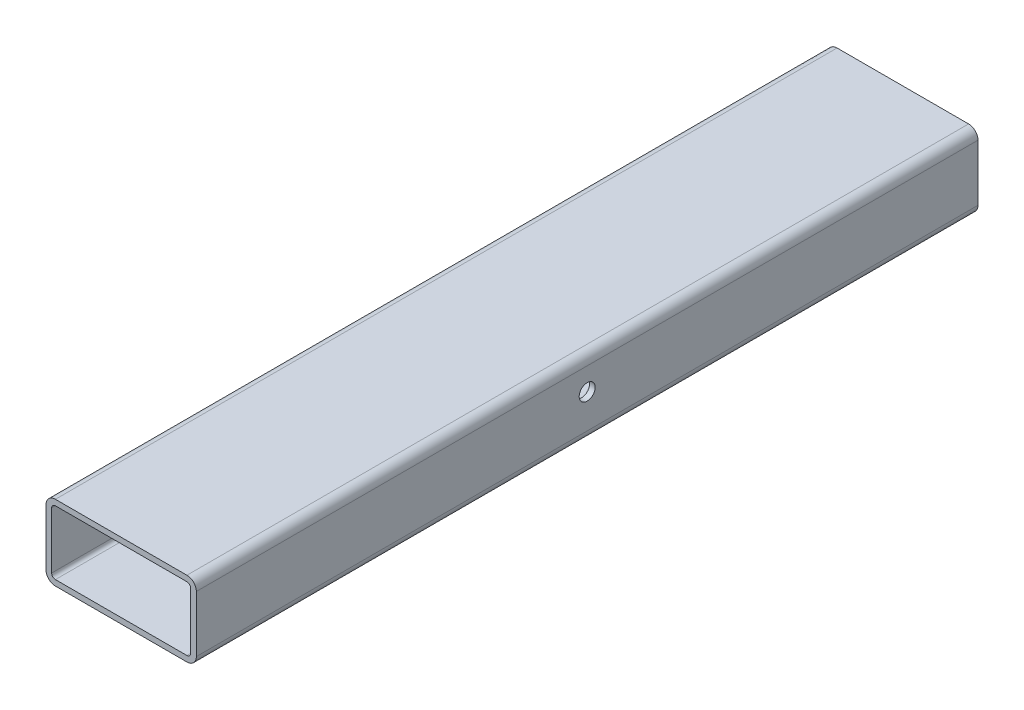
ISO-10303-21;
HEADER;
FILE_DESCRIPTION(('STEP AP214'),'2;1');
FILE_NAME('part.step','',(''),(''),'','','');
FILE_SCHEMA(('AUTOMOTIVE_DESIGN { 1 0 10303 214 1 1 1 1 }'));
ENDSEC;
DATA;
#1=APPLICATION_CONTEXT('core data for automotive mechanical design processes');
#2=APPLICATION_PROTOCOL_DEFINITION('international standard','automotive_design',2000,#1);
#3=PRODUCT_CONTEXT('',#1,'mechanical');
#4=PRODUCT('Part','Part','',(#3));
#5=PRODUCT_RELATED_PRODUCT_CATEGORY('part','',(#4));
#6=PRODUCT_DEFINITION_FORMATION('','',#4);
#7=PRODUCT_DEFINITION_CONTEXT('part definition',#1,'design');
#8=PRODUCT_DEFINITION('design','',#6,#7);
#9=PRODUCT_DEFINITION_SHAPE('','',#8);
#10=(LENGTH_UNIT() NAMED_UNIT(*) SI_UNIT(.MILLI.,.METRE.));
#11=(NAMED_UNIT(*) PLANE_ANGLE_UNIT() SI_UNIT($,.RADIAN.));
#12=(NAMED_UNIT(*) SI_UNIT($,.STERADIAN.) SOLID_ANGLE_UNIT());
#13=UNCERTAINTY_MEASURE_WITH_UNIT(LENGTH_MEASURE(1.E-05),#10,'distance_accuracy_value','');
#14=(GEOMETRIC_REPRESENTATION_CONTEXT(3) GLOBAL_UNCERTAINTY_ASSIGNED_CONTEXT((#13)) GLOBAL_UNIT_ASSIGNED_CONTEXT((#10,
#11,#12)) REPRESENTATION_CONTEXT('',''));
#15=CARTESIAN_POINT('',(0.,0.,0.));
#16=DIRECTION('',(0.,0.,1.));
#17=DIRECTION('',(1.,0.,0.));
#18=AXIS2_PLACEMENT_3D('',#15,#16,#17);
#19=CARTESIAN_POINT('',(35.,-15.,208.));
#20=DIRECTION('',(0.,0.,1.));
#21=DIRECTION('',(1.,0.,0.));
#22=AXIS2_PLACEMENT_3D('',#19,#20,#21);
#23=PLANE('',#22);
#24=CARTESIAN_POINT('',(35.,-15.,208.));
#25=DIRECTION('',(0.,0.,1.));
#26=DIRECTION('',(1.,0.,0.));
#27=AXIS2_PLACEMENT_3D('',#24,#25,#26);
#28=CIRCLE('',#27,5.);
#29=CARTESIAN_POINT('',(35.,-20.,208.));
#30=VERTEX_POINT('',#29);
#31=CARTESIAN_POINT('',(40.,-15.,208.));
#32=VERTEX_POINT('',#31);
#33=EDGE_CURVE('E225',#30,#32,#28,.T.);
#34=ORIENTED_EDGE('',*,*,#33,.T.);
#35=DIRECTION('',(0.,1.,0.));
#36=VECTOR('',#35,1.);
#37=CARTESIAN_POINT('',(40.,-15.,208.));
#38=LINE('',#37,#36);
#39=CARTESIAN_POINT('',(40.,15.,208.));
#40=VERTEX_POINT('',#39);
#41=EDGE_CURVE('E228',#32,#40,#38,.T.);
#42=ORIENTED_EDGE('',*,*,#41,.T.);
#43=CARTESIAN_POINT('',(35.,15.,208.));
#44=DIRECTION('',(0.,0.,1.));
#45=DIRECTION('',(-1.,0.,0.));
#46=AXIS2_PLACEMENT_3D('',#43,#44,#45);
#47=CIRCLE('',#46,5.);
#48=CARTESIAN_POINT('',(35.,20.,208.));
#49=VERTEX_POINT('',#48);
#50=EDGE_CURVE('E231',#40,#49,#47,.T.);
#51=ORIENTED_EDGE('',*,*,#50,.T.);
#52=DIRECTION('',(-1.,0.,0.));
#53=VECTOR('',#52,1.);
#54=CARTESIAN_POINT('',(-35.,20.,208.));
#55=LINE('',#54,#53);
#56=CARTESIAN_POINT('',(-35.,20.,208.));
#57=VERTEX_POINT('',#56);
#58=EDGE_CURVE('E233',#49,#57,#55,.T.);
#59=ORIENTED_EDGE('',*,*,#58,.T.);
#60=CARTESIAN_POINT('',(-35.,15.,208.));
#61=DIRECTION('',(0.,0.,1.));
#62=DIRECTION('',(-1.,0.,0.));
#63=AXIS2_PLACEMENT_3D('',#60,#61,#62);
#64=CIRCLE('',#63,5.);
#65=CARTESIAN_POINT('',(-40.,15.,208.));
#66=VERTEX_POINT('',#65);
#67=EDGE_CURVE('E235',#57,#66,#64,.T.);
#68=ORIENTED_EDGE('',*,*,#67,.T.);
#69=DIRECTION('',(0.,-1.,0.));
#70=VECTOR('',#69,1.);
#71=CARTESIAN_POINT('',(-40.,-15.,208.));
#72=LINE('',#71,#70);
#73=CARTESIAN_POINT('',(-40.,-15.,208.));
#74=VERTEX_POINT('',#73);
#75=EDGE_CURVE('E237',#66,#74,#72,.T.);
#76=ORIENTED_EDGE('',*,*,#75,.T.);
#77=CARTESIAN_POINT('',(-35.,-15.,208.));
#78=DIRECTION('',(0.,0.,1.));
#79=DIRECTION('',(-1.,0.,0.));
#80=AXIS2_PLACEMENT_3D('',#77,#78,#79);
#81=CIRCLE('',#80,5.);
#82=CARTESIAN_POINT('',(-35.,-20.,208.));
#83=VERTEX_POINT('',#82);
#84=EDGE_CURVE('E239',#74,#83,#81,.T.);
#85=ORIENTED_EDGE('',*,*,#84,.T.);
#86=DIRECTION('',(1.,0.,0.));
#87=VECTOR('',#86,1.);
#88=CARTESIAN_POINT('',(-35.,-20.,208.));
#89=LINE('',#88,#87);
#90=EDGE_CURVE('E241',#83,#30,#89,.T.);
#91=ORIENTED_EDGE('',*,*,#90,.T.);
#92=EDGE_LOOP('',(#34,#42,#51,#59,#68,#76,#85,#91));
#93=FACE_BOUND('',#92,.T.);
#94=DIRECTION('',(1.,0.,0.));
#95=VECTOR('',#94,1.);
#96=CARTESIAN_POINT('',(-35.,-17.,208.));
#97=LINE('',#96,#95);
#98=CARTESIAN_POINT('',(-35.,-17.,208.));
#99=VERTEX_POINT('',#98);
#100=CARTESIAN_POINT('',(35.,-17.,208.));
#101=VERTEX_POINT('',#100);
#102=EDGE_CURVE('E166',#99,#101,#97,.T.);
#103=ORIENTED_EDGE('',*,*,#102,.F.);
#104=CARTESIAN_POINT('',(-35.,-15.,208.));
#105=DIRECTION('',(0.,0.,1.));
#106=DIRECTION('',(-1.,0.,0.));
#107=AXIS2_PLACEMENT_3D('',#104,#105,#106);
#108=CIRCLE('',#107,2.);
#109=CARTESIAN_POINT('',(-37.,-15.,208.));
#110=VERTEX_POINT('',#109);
#111=EDGE_CURVE('E158',#110,#99,#108,.T.);
#112=ORIENTED_EDGE('',*,*,#111,.F.);
#113=DIRECTION('',(0.,-1.,0.));
#114=VECTOR('',#113,1.);
#115=CARTESIAN_POINT('',(-37.,-15.,208.));
#116=LINE('',#115,#114);
#117=CARTESIAN_POINT('',(-37.,15.,208.));
#118=VERTEX_POINT('',#117);
#119=EDGE_CURVE('E192',#118,#110,#116,.T.);
#120=ORIENTED_EDGE('',*,*,#119,.F.);
#121=CARTESIAN_POINT('',(-35.,15.,208.));
#122=DIRECTION('',(0.,0.,1.));
#123=DIRECTION('',(-1.,0.,0.));
#124=AXIS2_PLACEMENT_3D('',#121,#122,#123);
#125=CIRCLE('',#124,2.);
#126=CARTESIAN_POINT('',(-35.,17.,208.));
#127=VERTEX_POINT('',#126);
#128=EDGE_CURVE('E190',#127,#118,#125,.T.);
#129=ORIENTED_EDGE('',*,*,#128,.F.);
#130=DIRECTION('',(-1.,0.,0.));
#131=VECTOR('',#130,1.);
#132=CARTESIAN_POINT('',(-35.,17.,208.));
#133=LINE('',#132,#131);
#134=CARTESIAN_POINT('',(35.,17.,208.));
#135=VERTEX_POINT('',#134);
#136=EDGE_CURVE('E188',#135,#127,#133,.T.);
#137=ORIENTED_EDGE('',*,*,#136,.F.);
#138=CARTESIAN_POINT('',(35.,15.,208.));
#139=DIRECTION('',(0.,0.,1.));
#140=DIRECTION('',(-1.,0.,0.));
#141=AXIS2_PLACEMENT_3D('',#138,#139,#140);
#142=CIRCLE('',#141,2.);
#143=CARTESIAN_POINT('',(37.,15.,208.));
#144=VERTEX_POINT('',#143);
#145=EDGE_CURVE('E186',#144,#135,#142,.T.);
#146=ORIENTED_EDGE('',*,*,#145,.F.);
#147=DIRECTION('',(0.,1.,0.));
#148=VECTOR('',#147,1.);
#149=CARTESIAN_POINT('',(37.,-15.,208.));
#150=LINE('',#149,#148);
#151=CARTESIAN_POINT('',(37.,-15.,208.));
#152=VERTEX_POINT('',#151);
#153=EDGE_CURVE('E181',#152,#144,#150,.T.);
#154=ORIENTED_EDGE('',*,*,#153,.F.);
#155=CARTESIAN_POINT('',(35.,-15.,208.));
#156=DIRECTION('',(0.,0.,1.));
#157=DIRECTION('',(1.,0.,0.));
#158=AXIS2_PLACEMENT_3D('',#155,#156,#157);
#159=CIRCLE('',#158,2.);
#160=EDGE_CURVE('E179',#101,#152,#159,.T.);
#161=ORIENTED_EDGE('',*,*,#160,.F.);
#162=EDGE_LOOP('',(#103,#112,#120,#129,#137,#146,#154,#161));
#163=FACE_BOUND('',#162,.T.);
#164=ADVANCED_FACE('F45',(#93,#163),#23,.T.);
#165=CARTESIAN_POINT('',(35.,-15.,-208.));
#166=DIRECTION('',(0.,0.,1.));
#167=DIRECTION('',(1.,0.,0.));
#168=AXIS2_PLACEMENT_3D('',#165,#166,#167);
#169=PLANE('',#168);
#170=CARTESIAN_POINT('',(35.,-15.,-208.));
#171=DIRECTION('',(0.,0.,1.));
#172=DIRECTION('',(1.,0.,0.));
#173=AXIS2_PLACEMENT_3D('',#170,#171,#172);
#174=CIRCLE('',#173,5.);
#175=CARTESIAN_POINT('',(35.,-20.,-208.));
#176=VERTEX_POINT('',#175);
#177=CARTESIAN_POINT('',(40.,-15.,-208.));
#178=VERTEX_POINT('',#177);
#179=EDGE_CURVE('E174',#176,#178,#174,.T.);
#180=ORIENTED_EDGE('',*,*,#179,.F.);
#181=DIRECTION('',(1.,0.,0.));
#182=VECTOR('',#181,1.);
#183=CARTESIAN_POINT('',(-35.,-20.,-208.));
#184=LINE('',#183,#182);
#185=CARTESIAN_POINT('',(-35.,-20.,-208.));
#186=VERTEX_POINT('',#185);
#187=EDGE_CURVE('E229',#186,#176,#184,.T.);
#188=ORIENTED_EDGE('',*,*,#187,.F.);
#189=CARTESIAN_POINT('',(-35.,-15.,-208.));
#190=DIRECTION('',(0.,0.,1.));
#191=DIRECTION('',(-1.,0.,0.));
#192=AXIS2_PLACEMENT_3D('',#189,#190,#191);
#193=CIRCLE('',#192,5.);
#194=CARTESIAN_POINT('',(-40.,-15.,-208.));
#195=VERTEX_POINT('',#194);
#196=EDGE_CURVE('E256',#195,#186,#193,.T.);
#197=ORIENTED_EDGE('',*,*,#196,.F.);
#198=DIRECTION('',(0.,-1.,0.));
#199=VECTOR('',#198,1.);
#200=CARTESIAN_POINT('',(-40.,-15.,-208.));
#201=LINE('',#200,#199);
#202=CARTESIAN_POINT('',(-40.,15.,-208.));
#203=VERTEX_POINT('',#202);
#204=EDGE_CURVE('E254',#203,#195,#201,.T.);
#205=ORIENTED_EDGE('',*,*,#204,.F.);
#206=CARTESIAN_POINT('',(-35.,15.,-208.));
#207=DIRECTION('',(0.,0.,1.));
#208=DIRECTION('',(-1.,0.,0.));
#209=AXIS2_PLACEMENT_3D('',#206,#207,#208);
#210=CIRCLE('',#209,5.);
#211=CARTESIAN_POINT('',(-35.,20.,-208.));
#212=VERTEX_POINT('',#211);
#213=EDGE_CURVE('E252',#212,#203,#210,.T.);
#214=ORIENTED_EDGE('',*,*,#213,.F.);
#215=DIRECTION('',(-1.,0.,0.));
#216=VECTOR('',#215,1.);
#217=CARTESIAN_POINT('',(-35.,20.,-208.));
#218=LINE('',#217,#216);
#219=CARTESIAN_POINT('',(35.,20.,-208.));
#220=VERTEX_POINT('',#219);
#221=EDGE_CURVE('E250',#220,#212,#218,.T.);
#222=ORIENTED_EDGE('',*,*,#221,.F.);
#223=CARTESIAN_POINT('',(35.,15.,-208.));
#224=DIRECTION('',(0.,0.,1.));
#225=DIRECTION('',(-1.,0.,0.));
#226=AXIS2_PLACEMENT_3D('',#223,#224,#225);
#227=CIRCLE('',#226,5.);
#228=CARTESIAN_POINT('',(40.,15.,-208.));
#229=VERTEX_POINT('',#228);
#230=EDGE_CURVE('E248',#229,#220,#227,.T.);
#231=ORIENTED_EDGE('',*,*,#230,.F.);
#232=DIRECTION('',(0.,1.,0.));
#233=VECTOR('',#232,1.);
#234=CARTESIAN_POINT('',(40.,-15.,-208.));
#235=LINE('',#234,#233);
#236=EDGE_CURVE('E246',#178,#229,#235,.T.);
#237=ORIENTED_EDGE('',*,*,#236,.F.);
#238=EDGE_LOOP('',(#180,#188,#197,#205,#214,#222,#231,#237));
#239=FACE_BOUND('',#238,.T.);
#240=CARTESIAN_POINT('',(-35.,-15.,-208.));
#241=DIRECTION('',(0.,0.,1.));
#242=DIRECTION('',(-1.,0.,0.));
#243=AXIS2_PLACEMENT_3D('',#240,#241,#242);
#244=CIRCLE('',#243,2.);
#245=CARTESIAN_POINT('',(-37.,-15.,-208.));
#246=VERTEX_POINT('',#245);
#247=CARTESIAN_POINT('',(-35.,-17.,-208.));
#248=VERTEX_POINT('',#247);
#249=EDGE_CURVE('E68',#246,#248,#244,.T.);
#250=ORIENTED_EDGE('',*,*,#249,.T.);
#251=DIRECTION('',(1.,0.,0.));
#252=VECTOR('',#251,1.);
#253=CARTESIAN_POINT('',(-35.,-17.,-208.));
#254=LINE('',#253,#252);
#255=CARTESIAN_POINT('',(35.,-17.,-208.));
#256=VERTEX_POINT('',#255);
#257=EDGE_CURVE('E173',#248,#256,#254,.T.);
#258=ORIENTED_EDGE('',*,*,#257,.T.);
#259=CARTESIAN_POINT('',(35.,-15.,-208.));
#260=DIRECTION('',(0.,0.,1.));
#261=DIRECTION('',(1.,0.,0.));
#262=AXIS2_PLACEMENT_3D('',#259,#260,#261);
#263=CIRCLE('',#262,2.);
#264=CARTESIAN_POINT('',(37.,-15.,-208.));
#265=VERTEX_POINT('',#264);
#266=EDGE_CURVE('E197',#256,#265,#263,.T.);
#267=ORIENTED_EDGE('',*,*,#266,.T.);
#268=DIRECTION('',(0.,1.,0.));
#269=VECTOR('',#268,1.);
#270=CARTESIAN_POINT('',(37.,-15.,-208.));
#271=LINE('',#270,#269);
#272=CARTESIAN_POINT('',(37.,15.,-208.));
#273=VERTEX_POINT('',#272);
#274=EDGE_CURVE('E200',#265,#273,#271,.T.);
#275=ORIENTED_EDGE('',*,*,#274,.T.);
#276=CARTESIAN_POINT('',(35.,15.,-208.));
#277=DIRECTION('',(0.,0.,1.));
#278=DIRECTION('',(-1.,0.,0.));
#279=AXIS2_PLACEMENT_3D('',#276,#277,#278);
#280=CIRCLE('',#279,2.);
#281=CARTESIAN_POINT('',(35.,17.,-208.));
#282=VERTEX_POINT('',#281);
#283=EDGE_CURVE('E203',#273,#282,#280,.T.);
#284=ORIENTED_EDGE('',*,*,#283,.T.);
#285=DIRECTION('',(-1.,0.,0.));
#286=VECTOR('',#285,1.);
#287=CARTESIAN_POINT('',(-35.,17.,-208.));
#288=LINE('',#287,#286);
#289=CARTESIAN_POINT('',(-35.,17.,-208.));
#290=VERTEX_POINT('',#289);
#291=EDGE_CURVE('E206',#282,#290,#288,.T.);
#292=ORIENTED_EDGE('',*,*,#291,.T.);
#293=CARTESIAN_POINT('',(-35.,15.,-208.));
#294=DIRECTION('',(0.,0.,1.));
#295=DIRECTION('',(-1.,0.,0.));
#296=AXIS2_PLACEMENT_3D('',#293,#294,#295);
#297=CIRCLE('',#296,2.);
#298=CARTESIAN_POINT('',(-37.,15.,-208.));
#299=VERTEX_POINT('',#298);
#300=EDGE_CURVE('E209',#290,#299,#297,.T.);
#301=ORIENTED_EDGE('',*,*,#300,.T.);
#302=DIRECTION('',(0.,-1.,0.));
#303=VECTOR('',#302,1.);
#304=CARTESIAN_POINT('',(-37.,-15.,-208.));
#305=LINE('',#304,#303);
#306=EDGE_CURVE('E167',#299,#246,#305,.T.);
#307=ORIENTED_EDGE('',*,*,#306,.T.);
#308=EDGE_LOOP('',(#250,#258,#267,#275,#284,#292,#301,#307));
#309=FACE_BOUND('',#308,.T.);
#310=ADVANCED_FACE('F286',(#239,#309),#169,.F.);
#311=CARTESIAN_POINT('',(35.,-15.,208.));
#312=DIRECTION('',(0.,0.,-1.));
#313=DIRECTION('',(-1.,0.,0.));
#314=AXIS2_PLACEMENT_3D('',#311,#312,#313);
#315=CYLINDRICAL_SURFACE('',#314,5.);
#316=ORIENTED_EDGE('',*,*,#179,.T.);
#317=DIRECTION('',(0.,0.,-1.));
#318=VECTOR('',#317,1.);
#319=CARTESIAN_POINT('',(40.,-15.,208.));
#320=LINE('',#319,#318);
#321=EDGE_CURVE('E11',#32,#178,#320,.T.);
#322=ORIENTED_EDGE('',*,*,#321,.F.);
#323=ORIENTED_EDGE('',*,*,#33,.F.);
#324=DIRECTION('',(0.,0.,-1.));
#325=VECTOR('',#324,1.);
#326=CARTESIAN_POINT('',(35.,-20.,208.));
#327=LINE('',#326,#325);
#328=EDGE_CURVE('E243',#30,#176,#327,.T.);
#329=ORIENTED_EDGE('',*,*,#328,.T.);
#330=EDGE_LOOP('',(#316,#322,#323,#329));
#331=FACE_BOUND('',#330,.T.);
#332=ADVANCED_FACE('F47',(#331),#315,.T.);
#333=CARTESIAN_POINT('',(40.,-15.,208.));
#334=DIRECTION('',(-1.,0.,0.));
#335=DIRECTION('',(0.,-1.,0.));
#336=AXIS2_PLACEMENT_3D('',#333,#334,#335);
#337=PLANE('',#336);
#338=CARTESIAN_POINT('',(40.,3.00000000000013,0.));
#339=DIRECTION('',(1.,0.,0.));
#340=DIRECTION('',(0.,0.,-1.));
#341=AXIS2_PLACEMENT_3D('',#338,#339,#340);
#342=CIRCLE('',#341,4.24999999999999);
#343=CARTESIAN_POINT('',(40.,3.00000000000013,-4.24999999999999));
#344=VERTEX_POINT('',#343);
#345=EDGE_CURVE('E378',#344,#344,#342,.T.);
#346=ORIENTED_EDGE('',*,*,#345,.F.);
#347=EDGE_LOOP('',(#346));
#348=FACE_BOUND('',#347,.T.);
#349=ORIENTED_EDGE('',*,*,#236,.T.);
#350=DIRECTION('',(0.,0.,-1.));
#351=VECTOR('',#350,1.);
#352=CARTESIAN_POINT('',(40.,15.,208.));
#353=LINE('',#352,#351);
#354=EDGE_CURVE('E53',#40,#229,#353,.T.);
#355=ORIENTED_EDGE('',*,*,#354,.F.);
#356=ORIENTED_EDGE('',*,*,#41,.F.);
#357=ORIENTED_EDGE('',*,*,#321,.T.);
#358=EDGE_LOOP('',(#349,#355,#356,#357));
#359=FACE_BOUND('',#358,.T.);
#360=ADVANCED_FACE('F303',(#348,#359),#337,.F.);
#361=CARTESIAN_POINT('',(35.,15.,208.));
#362=DIRECTION('',(0.,0.,-1.));
#363=DIRECTION('',(-1.,0.,0.));
#364=AXIS2_PLACEMENT_3D('',#361,#362,#363);
#365=CYLINDRICAL_SURFACE('',#364,5.);
#366=ORIENTED_EDGE('',*,*,#230,.T.);
#367=DIRECTION('',(0.,0.,-1.));
#368=VECTOR('',#367,1.);
#369=CARTESIAN_POINT('',(35.,20.,208.));
#370=LINE('',#369,#368);
#371=EDGE_CURVE('E273',#49,#220,#370,.T.);
#372=ORIENTED_EDGE('',*,*,#371,.F.);
#373=ORIENTED_EDGE('',*,*,#50,.F.);
#374=ORIENTED_EDGE('',*,*,#354,.T.);
#375=EDGE_LOOP('',(#366,#372,#373,#374));
#376=FACE_BOUND('',#375,.T.);
#377=ADVANCED_FACE('F280',(#376),#365,.T.);
#378=CARTESIAN_POINT('',(-35.,20.,208.));
#379=DIRECTION('',(0.,-1.,0.));
#380=DIRECTION('',(0.,0.,-1.));
#381=AXIS2_PLACEMENT_3D('',#378,#379,#380);
#382=PLANE('',#381);
#383=ORIENTED_EDGE('',*,*,#221,.T.);
#384=DIRECTION('',(0.,0.,-1.));
#385=VECTOR('',#384,1.);
#386=CARTESIAN_POINT('',(-35.,20.,208.));
#387=LINE('',#386,#385);
#388=EDGE_CURVE('E270',#57,#212,#387,.T.);
#389=ORIENTED_EDGE('',*,*,#388,.F.);
#390=ORIENTED_EDGE('',*,*,#58,.F.);
#391=ORIENTED_EDGE('',*,*,#371,.T.);
#392=EDGE_LOOP('',(#383,#389,#390,#391));
#393=FACE_BOUND('',#392,.T.);
#394=ADVANCED_FACE('F292',(#393),#382,.F.);
#395=CARTESIAN_POINT('',(-35.,15.,208.));
#396=DIRECTION('',(0.,0.,-1.));
#397=DIRECTION('',(-1.,0.,0.));
#398=AXIS2_PLACEMENT_3D('',#395,#396,#397);
#399=CYLINDRICAL_SURFACE('',#398,5.);
#400=ORIENTED_EDGE('',*,*,#213,.T.);
#401=DIRECTION('',(0.,0.,-1.));
#402=VECTOR('',#401,1.);
#403=CARTESIAN_POINT('',(-40.,15.,208.));
#404=LINE('',#403,#402);
#405=EDGE_CURVE('E267',#66,#203,#404,.T.);
#406=ORIENTED_EDGE('',*,*,#405,.F.);
#407=ORIENTED_EDGE('',*,*,#67,.F.);
#408=ORIENTED_EDGE('',*,*,#388,.T.);
#409=EDGE_LOOP('',(#400,#406,#407,#408));
#410=FACE_BOUND('',#409,.T.);
#411=ADVANCED_FACE('F296',(#410),#399,.T.);
#412=CARTESIAN_POINT('',(-40.,-15.,208.));
#413=DIRECTION('',(1.,0.,0.));
#414=DIRECTION('',(0.,1.,0.));
#415=AXIS2_PLACEMENT_3D('',#412,#413,#414);
#416=PLANE('',#415);
#417=ORIENTED_EDGE('',*,*,#204,.T.);
#418=DIRECTION('',(0.,0.,-1.));
#419=VECTOR('',#418,1.);
#420=CARTESIAN_POINT('',(-40.,-15.,208.));
#421=LINE('',#420,#419);
#422=EDGE_CURVE('E264',#74,#195,#421,.T.);
#423=ORIENTED_EDGE('',*,*,#422,.F.);
#424=ORIENTED_EDGE('',*,*,#75,.F.);
#425=ORIENTED_EDGE('',*,*,#405,.T.);
#426=EDGE_LOOP('',(#417,#423,#424,#425));
#427=FACE_BOUND('',#426,.T.);
#428=ADVANCED_FACE('F316',(#427),#416,.F.);
#429=CARTESIAN_POINT('',(-35.,-15.,208.));
#430=DIRECTION('',(0.,0.,-1.));
#431=DIRECTION('',(-1.,0.,0.));
#432=AXIS2_PLACEMENT_3D('',#429,#430,#431);
#433=CYLINDRICAL_SURFACE('',#432,5.);
#434=ORIENTED_EDGE('',*,*,#196,.T.);
#435=DIRECTION('',(0.,0.,-1.));
#436=VECTOR('',#435,1.);
#437=CARTESIAN_POINT('',(-35.,-20.,208.));
#438=LINE('',#437,#436);
#439=EDGE_CURVE('E261',#83,#186,#438,.T.);
#440=ORIENTED_EDGE('',*,*,#439,.F.);
#441=ORIENTED_EDGE('',*,*,#84,.F.);
#442=ORIENTED_EDGE('',*,*,#422,.T.);
#443=EDGE_LOOP('',(#434,#440,#441,#442));
#444=FACE_BOUND('',#443,.T.);
#445=ADVANCED_FACE('F314',(#444),#433,.T.);
#446=CARTESIAN_POINT('',(-35.,-20.,208.));
#447=DIRECTION('',(0.,1.,0.));
#448=DIRECTION('',(0.,0.,1.));
#449=AXIS2_PLACEMENT_3D('',#446,#447,#448);
#450=PLANE('',#449);
#451=ORIENTED_EDGE('',*,*,#187,.T.);
#452=ORIENTED_EDGE('',*,*,#328,.F.);
#453=ORIENTED_EDGE('',*,*,#90,.F.);
#454=ORIENTED_EDGE('',*,*,#439,.T.);
#455=EDGE_LOOP('',(#451,#452,#453,#454));
#456=FACE_BOUND('',#455,.T.);
#457=ADVANCED_FACE('F309',(#456),#450,.F.);
#458=CARTESIAN_POINT('',(-35.,-15.,208.));
#459=DIRECTION('',(0.,0.,-1.));
#460=DIRECTION('',(-1.,0.,0.));
#461=AXIS2_PLACEMENT_3D('',#458,#459,#460);
#462=CYLINDRICAL_SURFACE('',#461,2.);
#463=ORIENTED_EDGE('',*,*,#249,.F.);
#464=DIRECTION('',(0.,0.,-1.));
#465=VECTOR('',#464,1.);
#466=CARTESIAN_POINT('',(-37.,-15.,208.));
#467=LINE('',#466,#465);
#468=EDGE_CURVE('E162',#110,#246,#467,.T.);
#469=ORIENTED_EDGE('',*,*,#468,.F.);
#470=ORIENTED_EDGE('',*,*,#111,.T.);
#471=DIRECTION('',(0.,0.,-1.));
#472=VECTOR('',#471,1.);
#473=CARTESIAN_POINT('',(-35.,-17.,208.));
#474=LINE('',#473,#472);
#475=EDGE_CURVE('E161',#99,#248,#474,.T.);
#476=ORIENTED_EDGE('',*,*,#475,.T.);
#477=EDGE_LOOP('',(#463,#469,#470,#476));
#478=FACE_BOUND('',#477,.T.);
#479=ADVANCED_FACE('F160',(#478),#462,.F.);
#480=CARTESIAN_POINT('',(-35.,-17.,208.));
#481=DIRECTION('',(0.,1.,0.));
#482=DIRECTION('',(0.,0.,1.));
#483=AXIS2_PLACEMENT_3D('',#480,#481,#482);
#484=PLANE('',#483);
#485=ORIENTED_EDGE('',*,*,#257,.F.);
#486=ORIENTED_EDGE('',*,*,#475,.F.);
#487=ORIENTED_EDGE('',*,*,#102,.T.);
#488=DIRECTION('',(0.,0.,-1.));
#489=VECTOR('',#488,1.);
#490=CARTESIAN_POINT('',(35.,-17.,208.));
#491=LINE('',#490,#489);
#492=EDGE_CURVE('E175',#101,#256,#491,.T.);
#493=ORIENTED_EDGE('',*,*,#492,.T.);
#494=EDGE_LOOP('',(#485,#486,#487,#493));
#495=FACE_BOUND('',#494,.T.);
#496=ADVANCED_FACE('F170',(#495),#484,.T.);
#497=CARTESIAN_POINT('',(35.,-15.,208.));
#498=DIRECTION('',(0.,0.,-1.));
#499=DIRECTION('',(-1.,0.,0.));
#500=AXIS2_PLACEMENT_3D('',#497,#498,#499);
#501=CYLINDRICAL_SURFACE('',#500,2.);
#502=ORIENTED_EDGE('',*,*,#266,.F.);
#503=ORIENTED_EDGE('',*,*,#492,.F.);
#504=ORIENTED_EDGE('',*,*,#160,.T.);
#505=DIRECTION('',(0.,0.,-1.));
#506=VECTOR('',#505,1.);
#507=CARTESIAN_POINT('',(37.,-15.,208.));
#508=LINE('',#507,#506);
#509=EDGE_CURVE('E222',#152,#265,#508,.T.);
#510=ORIENTED_EDGE('',*,*,#509,.T.);
#511=EDGE_LOOP('',(#502,#503,#504,#510));
#512=FACE_BOUND('',#511,.T.);
#513=ADVANCED_FACE('F341',(#512),#501,.F.);
#514=CARTESIAN_POINT('',(37.,-15.,208.));
#515=DIRECTION('',(-1.,0.,0.));
#516=DIRECTION('',(0.,-1.,0.));
#517=AXIS2_PLACEMENT_3D('',#514,#515,#516);
#518=PLANE('',#517);
#519=CARTESIAN_POINT('',(37.,3.00000000000013,0.));
#520=DIRECTION('',(-1.,0.,0.));
#521=DIRECTION('',(0.,-1.,0.));
#522=AXIS2_PLACEMENT_3D('',#519,#520,#521);
#523=CIRCLE('',#522,4.24999999999999);
#524=CARTESIAN_POINT('',(37.,-1.24999999999986,0.));
#525=VERTEX_POINT('',#524);
#526=EDGE_CURVE('E195',#525,#525,#523,.T.);
#527=ORIENTED_EDGE('',*,*,#526,.F.);
#528=EDGE_LOOP('',(#527));
#529=FACE_BOUND('',#528,.T.);
#530=ORIENTED_EDGE('',*,*,#274,.F.);
#531=ORIENTED_EDGE('',*,*,#509,.F.);
#532=ORIENTED_EDGE('',*,*,#153,.T.);
#533=DIRECTION('',(0.,0.,-1.));
#534=VECTOR('',#533,1.);
#535=CARTESIAN_POINT('',(37.,15.,208.));
#536=LINE('',#535,#534);
#537=EDGE_CURVE('E220',#144,#273,#536,.T.);
#538=ORIENTED_EDGE('',*,*,#537,.T.);
#539=EDGE_LOOP('',(#530,#531,#532,#538));
#540=FACE_BOUND('',#539,.T.);
#541=ADVANCED_FACE('F345',(#529,#540),#518,.T.);
#542=CARTESIAN_POINT('',(35.,15.,208.));
#543=DIRECTION('',(0.,0.,-1.));
#544=DIRECTION('',(-1.,0.,0.));
#545=AXIS2_PLACEMENT_3D('',#542,#543,#544);
#546=CYLINDRICAL_SURFACE('',#545,2.);
#547=ORIENTED_EDGE('',*,*,#283,.F.);
#548=ORIENTED_EDGE('',*,*,#537,.F.);
#549=ORIENTED_EDGE('',*,*,#145,.T.);
#550=DIRECTION('',(0.,0.,-1.));
#551=VECTOR('',#550,1.);
#552=CARTESIAN_POINT('',(35.,17.,208.));
#553=LINE('',#552,#551);
#554=EDGE_CURVE('E218',#135,#282,#553,.T.);
#555=ORIENTED_EDGE('',*,*,#554,.T.);
#556=EDGE_LOOP('',(#547,#548,#549,#555));
#557=FACE_BOUND('',#556,.T.);
#558=ADVANCED_FACE('F351',(#557),#546,.F.);
#559=CARTESIAN_POINT('',(-35.,17.,208.));
#560=DIRECTION('',(0.,-1.,0.));
#561=DIRECTION('',(0.,0.,-1.));
#562=AXIS2_PLACEMENT_3D('',#559,#560,#561);
#563=PLANE('',#562);
#564=ORIENTED_EDGE('',*,*,#291,.F.);
#565=ORIENTED_EDGE('',*,*,#554,.F.);
#566=ORIENTED_EDGE('',*,*,#136,.T.);
#567=DIRECTION('',(0.,0.,-1.));
#568=VECTOR('',#567,1.);
#569=CARTESIAN_POINT('',(-35.,17.,208.));
#570=LINE('',#569,#568);
#571=EDGE_CURVE('E216',#127,#290,#570,.T.);
#572=ORIENTED_EDGE('',*,*,#571,.T.);
#573=EDGE_LOOP('',(#564,#565,#566,#572));
#574=FACE_BOUND('',#573,.T.);
#575=ADVANCED_FACE('F355',(#574),#563,.T.);
#576=CARTESIAN_POINT('',(-35.,15.,208.));
#577=DIRECTION('',(0.,0.,-1.));
#578=DIRECTION('',(-1.,0.,0.));
#579=AXIS2_PLACEMENT_3D('',#576,#577,#578);
#580=CYLINDRICAL_SURFACE('',#579,2.);
#581=ORIENTED_EDGE('',*,*,#300,.F.);
#582=ORIENTED_EDGE('',*,*,#571,.F.);
#583=ORIENTED_EDGE('',*,*,#128,.T.);
#584=DIRECTION('',(0.,0.,-1.));
#585=VECTOR('',#584,1.);
#586=CARTESIAN_POINT('',(-37.,15.,208.));
#587=LINE('',#586,#585);
#588=EDGE_CURVE('E60',#118,#299,#587,.T.);
#589=ORIENTED_EDGE('',*,*,#588,.T.);
#590=EDGE_LOOP('',(#581,#582,#583,#589));
#591=FACE_BOUND('',#590,.T.);
#592=ADVANCED_FACE('F359',(#591),#580,.F.);
#593=CARTESIAN_POINT('',(-37.,-15.,208.));
#594=DIRECTION('',(1.,0.,0.));
#595=DIRECTION('',(0.,1.,0.));
#596=AXIS2_PLACEMENT_3D('',#593,#594,#595);
#597=PLANE('',#596);
#598=ORIENTED_EDGE('',*,*,#306,.F.);
#599=ORIENTED_EDGE('',*,*,#588,.F.);
#600=ORIENTED_EDGE('',*,*,#119,.T.);
#601=ORIENTED_EDGE('',*,*,#468,.T.);
#602=EDGE_LOOP('',(#598,#599,#600,#601));
#603=FACE_BOUND('',#602,.T.);
#604=ADVANCED_FACE('F363',(#603),#597,.T.);
#605=CARTESIAN_POINT('',(40.,3.00000000000013,0.));
#606=DIRECTION('',(1.,0.,0.));
#607=DIRECTION('',(0.,0.,-1.));
#608=AXIS2_PLACEMENT_3D('',#605,#606,#607);
#609=CYLINDRICAL_SURFACE('',#608,4.24999999999999);
#610=ORIENTED_EDGE('',*,*,#526,.T.);
#611=EDGE_LOOP('',(#610));
#612=FACE_BOUND('',#611,.T.);
#613=ORIENTED_EDGE('',*,*,#345,.T.);
#614=EDGE_LOOP('',(#613));
#615=FACE_BOUND('',#614,.T.);
#616=ADVANCED_FACE('F367',(#612,#615),#609,.F.);
#617=CLOSED_SHELL('',(#164,#310,#332,#360,#377,#394,#411,#428,#445,#457,#479,#496,#513,#541,
#558,#575,#592,#604,#616));
#618=MANIFOLD_SOLID_BREP('B2',#617);
#619=ADVANCED_BREP_SHAPE_REPRESENTATION('',(#18,#618),#14);
#620=SHAPE_DEFINITION_REPRESENTATION(#9,#619);
ENDSEC;
END-ISO-10303-21;
